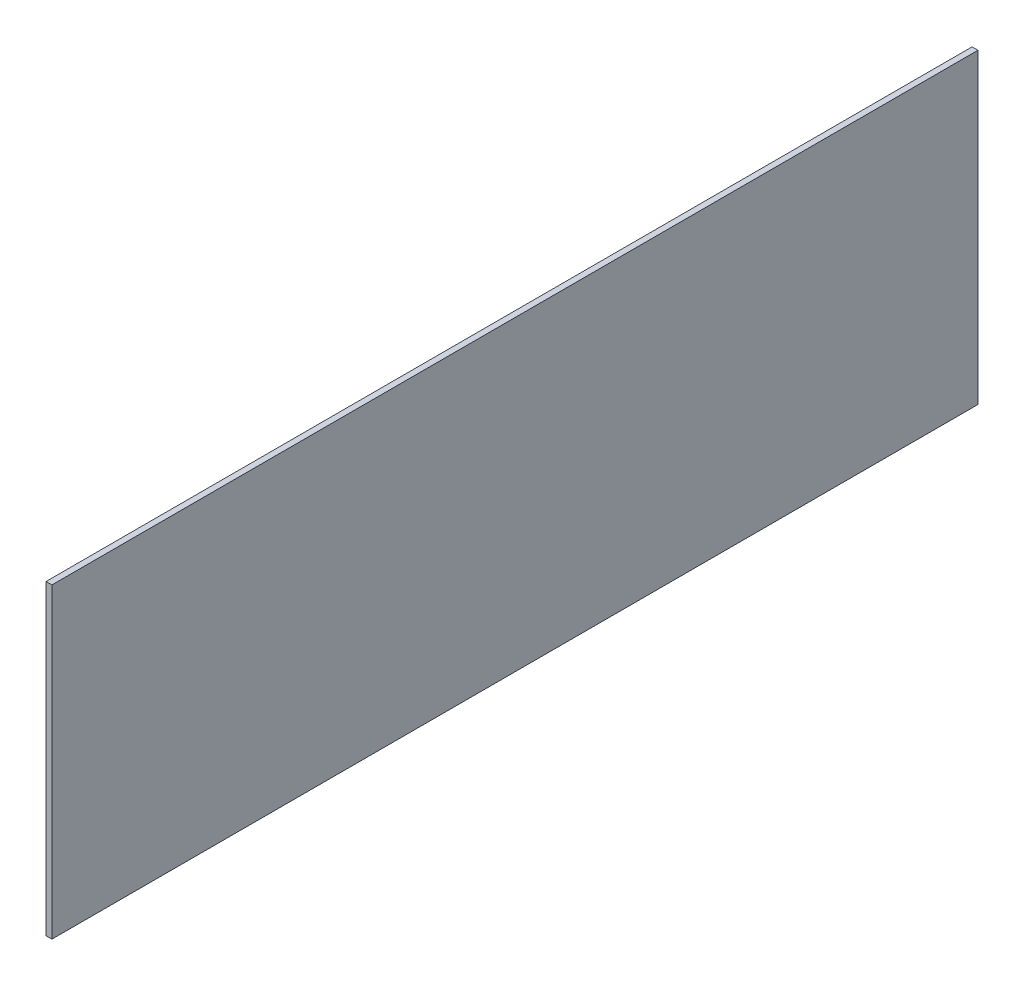
ISO-10303-21;
HEADER;
FILE_DESCRIPTION(('STEP AP214'),'2;1');
FILE_NAME('part.step','',(''),(''),'','','');
FILE_SCHEMA(('AUTOMOTIVE_DESIGN { 1 0 10303 214 1 1 1 1 }'));
ENDSEC;
DATA;
#1=APPLICATION_CONTEXT('core data for automotive mechanical design processes');
#2=APPLICATION_PROTOCOL_DEFINITION('international standard','automotive_design',2000,#1);
#3=PRODUCT_CONTEXT('',#1,'mechanical');
#4=PRODUCT('Part','Part','',(#3));
#5=PRODUCT_RELATED_PRODUCT_CATEGORY('part','',(#4));
#6=PRODUCT_DEFINITION_FORMATION('','',#4);
#7=PRODUCT_DEFINITION_CONTEXT('part definition',#1,'design');
#8=PRODUCT_DEFINITION('design','',#6,#7);
#9=PRODUCT_DEFINITION_SHAPE('','',#8);
#10=(LENGTH_UNIT() NAMED_UNIT(*) SI_UNIT(.MILLI.,.METRE.));
#11=(NAMED_UNIT(*) PLANE_ANGLE_UNIT() SI_UNIT($,.RADIAN.));
#12=(NAMED_UNIT(*) SI_UNIT($,.STERADIAN.) SOLID_ANGLE_UNIT());
#13=UNCERTAINTY_MEASURE_WITH_UNIT(LENGTH_MEASURE(1.E-05),#10,'distance_accuracy_value','');
#14=(GEOMETRIC_REPRESENTATION_CONTEXT(3) GLOBAL_UNCERTAINTY_ASSIGNED_CONTEXT((#13)) GLOBAL_UNIT_ASSIGNED_CONTEXT((#10,
#11,#12)) REPRESENTATION_CONTEXT('',''));
#15=CARTESIAN_POINT('',(0.,0.,0.));
#16=DIRECTION('',(0.,0.,1.));
#17=DIRECTION('',(1.,0.,0.));
#18=AXIS2_PLACEMENT_3D('',#15,#16,#17);
#19=CARTESIAN_POINT('',(1.5875,82.55,-249.174));
#20=DIRECTION('',(0.,0.,1.));
#21=DIRECTION('',(0.,-1.,0.));
#22=AXIS2_PLACEMENT_3D('',#19,#20,#21);
#23=PLANE('',#22);
#24=DIRECTION('',(0.,1.,0.));
#25=VECTOR('',#24,1.);
#26=CARTESIAN_POINT('',(-1.5875,82.55,-249.174));
#27=LINE('',#26,#25);
#28=CARTESIAN_POINT('',(-1.5875,-82.55,-249.174));
#29=VERTEX_POINT('',#28);
#30=CARTESIAN_POINT('',(-1.5875,82.55,-249.174));
#31=VERTEX_POINT('',#30);
#32=EDGE_CURVE('E98',#29,#31,#27,.T.);
#33=ORIENTED_EDGE('',*,*,#32,.T.);
#34=DIRECTION('',(-1.,0.,0.));
#35=VECTOR('',#34,1.);
#36=CARTESIAN_POINT('',(1.5875,82.55,-249.174));
#37=LINE('',#36,#35);
#38=CARTESIAN_POINT('',(1.5875,82.55,-249.174));
#39=VERTEX_POINT('',#38);
#40=EDGE_CURVE('E11',#39,#31,#37,.T.);
#41=ORIENTED_EDGE('',*,*,#40,.F.);
#42=DIRECTION('',(0.,1.,0.));
#43=VECTOR('',#42,1.);
#44=CARTESIAN_POINT('',(1.5875,82.55,-249.174));
#45=LINE('',#44,#43);
#46=CARTESIAN_POINT('',(1.5875,-82.55,-249.174));
#47=VERTEX_POINT('',#46);
#48=EDGE_CURVE('E86',#47,#39,#45,.T.);
#49=ORIENTED_EDGE('',*,*,#48,.F.);
#50=DIRECTION('',(-1.,0.,0.));
#51=VECTOR('',#50,1.);
#52=CARTESIAN_POINT('',(1.5875,-82.55,-249.174));
#53=LINE('',#52,#51);
#54=EDGE_CURVE('E94',#47,#29,#53,.T.);
#55=ORIENTED_EDGE('',*,*,#54,.T.);
#56=EDGE_LOOP('',(#33,#41,#49,#55));
#57=FACE_BOUND('',#56,.T.);
#58=ADVANCED_FACE('F35',(#57),#23,.F.);
#59=CARTESIAN_POINT('',(1.5875,82.55,249.174));
#60=DIRECTION('',(0.,-1.,0.));
#61=DIRECTION('',(0.,0.,-1.));
#62=AXIS2_PLACEMENT_3D('',#59,#60,#61);
#63=PLANE('',#62);
#64=DIRECTION('',(0.,0.,1.));
#65=VECTOR('',#64,1.);
#66=CARTESIAN_POINT('',(-1.5875,82.55,249.174));
#67=LINE('',#66,#65);
#68=CARTESIAN_POINT('',(-1.5875,82.55,249.174));
#69=VERTEX_POINT('',#68);
#70=EDGE_CURVE('E90',#31,#69,#67,.T.);
#71=ORIENTED_EDGE('',*,*,#70,.T.);
#72=DIRECTION('',(-1.,0.,0.));
#73=VECTOR('',#72,1.);
#74=CARTESIAN_POINT('',(1.5875,82.55,249.174));
#75=LINE('',#74,#73);
#76=CARTESIAN_POINT('',(1.5875,82.55,249.174));
#77=VERTEX_POINT('',#76);
#78=EDGE_CURVE('E43',#77,#69,#75,.T.);
#79=ORIENTED_EDGE('',*,*,#78,.F.);
#80=DIRECTION('',(0.,0.,1.));
#81=VECTOR('',#80,1.);
#82=CARTESIAN_POINT('',(1.5875,82.55,249.174));
#83=LINE('',#82,#81);
#84=EDGE_CURVE('E81',#39,#77,#83,.T.);
#85=ORIENTED_EDGE('',*,*,#84,.F.);
#86=ORIENTED_EDGE('',*,*,#40,.T.);
#87=EDGE_LOOP('',(#71,#79,#85,#86));
#88=FACE_BOUND('',#87,.T.);
#89=ADVANCED_FACE('F89',(#88),#63,.F.);
#90=CARTESIAN_POINT('',(1.5875,82.55,249.174));
#91=DIRECTION('',(0.,0.,-1.));
#92=DIRECTION('',(-1.,0.,0.));
#93=AXIS2_PLACEMENT_3D('',#90,#91,#92);
#94=PLANE('',#93);
#95=DIRECTION('',(0.,-1.,0.));
#96=VECTOR('',#95,1.);
#97=CARTESIAN_POINT('',(-1.5875,82.55,249.174));
#98=LINE('',#97,#96);
#99=CARTESIAN_POINT('',(-1.5875,-82.55,249.174));
#100=VERTEX_POINT('',#99);
#101=EDGE_CURVE('E68',#69,#100,#98,.T.);
#102=ORIENTED_EDGE('',*,*,#101,.T.);
#103=DIRECTION('',(-1.,0.,0.));
#104=VECTOR('',#103,1.);
#105=CARTESIAN_POINT('',(1.5875,-82.55,249.174));
#106=LINE('',#105,#104);
#107=CARTESIAN_POINT('',(1.5875,-82.55,249.174));
#108=VERTEX_POINT('',#107);
#109=EDGE_CURVE('E91',#108,#100,#106,.T.);
#110=ORIENTED_EDGE('',*,*,#109,.F.);
#111=DIRECTION('',(0.,-1.,0.));
#112=VECTOR('',#111,1.);
#113=CARTESIAN_POINT('',(1.5875,82.55,249.174));
#114=LINE('',#113,#112);
#115=EDGE_CURVE('E84',#77,#108,#114,.T.);
#116=ORIENTED_EDGE('',*,*,#115,.F.);
#117=ORIENTED_EDGE('',*,*,#78,.T.);
#118=EDGE_LOOP('',(#102,#110,#116,#117));
#119=FACE_BOUND('',#118,.T.);
#120=ADVANCED_FACE('F92',(#119),#94,.F.);
#121=CARTESIAN_POINT('',(1.5875,-82.55,249.174));
#122=DIRECTION('',(0.,1.,0.));
#123=DIRECTION('',(0.,0.,1.));
#124=AXIS2_PLACEMENT_3D('',#121,#122,#123);
#125=PLANE('',#124);
#126=DIRECTION('',(0.,0.,-1.));
#127=VECTOR('',#126,1.);
#128=CARTESIAN_POINT('',(-1.5875,-82.55,249.174));
#129=LINE('',#128,#127);
#130=EDGE_CURVE('E74',#100,#29,#129,.T.);
#131=ORIENTED_EDGE('',*,*,#130,.T.);
#132=ORIENTED_EDGE('',*,*,#54,.F.);
#133=DIRECTION('',(0.,0.,-1.));
#134=VECTOR('',#133,1.);
#135=CARTESIAN_POINT('',(1.5875,-82.55,249.174));
#136=LINE('',#135,#134);
#137=EDGE_CURVE('E51',#108,#47,#136,.T.);
#138=ORIENTED_EDGE('',*,*,#137,.F.);
#139=ORIENTED_EDGE('',*,*,#109,.T.);
#140=EDGE_LOOP('',(#131,#132,#138,#139));
#141=FACE_BOUND('',#140,.T.);
#142=ADVANCED_FACE('F105',(#141),#125,.F.);
#143=CARTESIAN_POINT('',(1.5875,0.,0.));
#144=DIRECTION('',(1.,0.,0.));
#145=DIRECTION('',(0.,0.,-1.));
#146=AXIS2_PLACEMENT_3D('',#143,#144,#145);
#147=PLANE('',#146);
#148=ORIENTED_EDGE('',*,*,#48,.T.);
#149=ORIENTED_EDGE('',*,*,#84,.T.);
#150=ORIENTED_EDGE('',*,*,#115,.T.);
#151=ORIENTED_EDGE('',*,*,#137,.T.);
#152=EDGE_LOOP('',(#148,#149,#150,#151));
#153=FACE_BOUND('',#152,.T.);
#154=ADVANCED_FACE('F82',(#153),#147,.T.);
#155=CARTESIAN_POINT('',(-1.5875,0.,0.));
#156=DIRECTION('',(1.,0.,0.));
#157=DIRECTION('',(0.,0.,-1.));
#158=AXIS2_PLACEMENT_3D('',#155,#156,#157);
#159=PLANE('',#158);
#160=ORIENTED_EDGE('',*,*,#32,.F.);
#161=ORIENTED_EDGE('',*,*,#130,.F.);
#162=ORIENTED_EDGE('',*,*,#101,.F.);
#163=ORIENTED_EDGE('',*,*,#70,.F.);
#164=EDGE_LOOP('',(#160,#161,#162,#163));
#165=FACE_BOUND('',#164,.T.);
#166=ADVANCED_FACE('F108',(#165),#159,.F.);
#167=CLOSED_SHELL('',(#58,#89,#120,#142,#154,#166));
#168=MANIFOLD_SOLID_BREP('B2',#167);
#169=ADVANCED_BREP_SHAPE_REPRESENTATION('',(#18,#168),#14);
#170=SHAPE_DEFINITION_REPRESENTATION(#9,#169);
ENDSEC;
END-ISO-10303-21;
